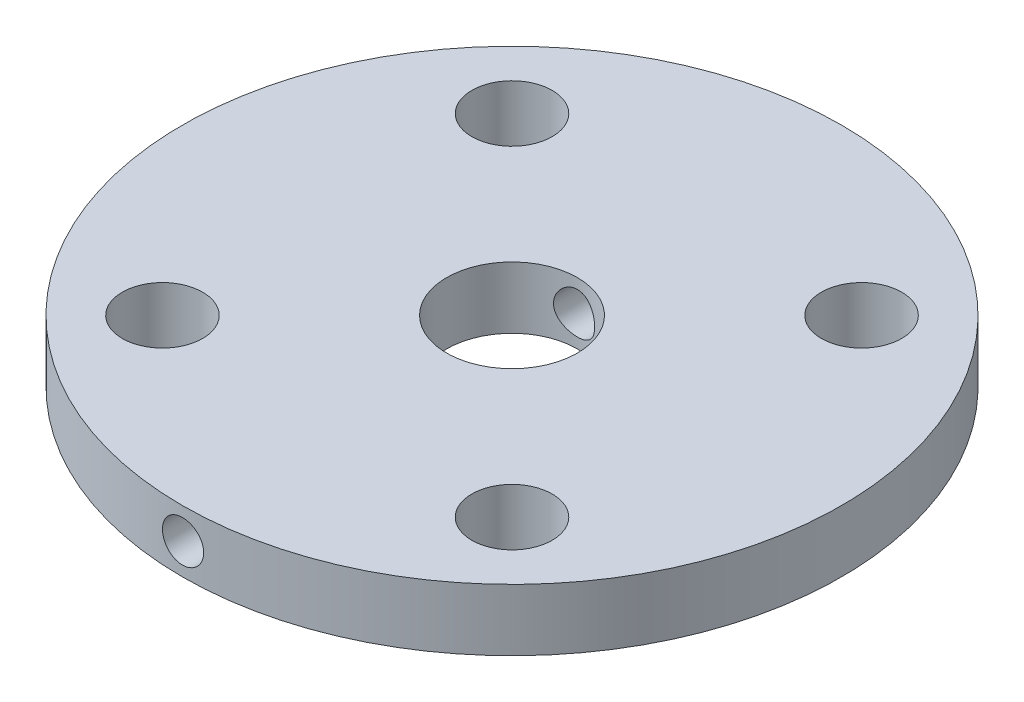
ISO-10303-21;
HEADER;
FILE_DESCRIPTION(('STEP AP214'),'2;1');
FILE_NAME('part.step','',(''),(''),'','','');
FILE_SCHEMA(('AUTOMOTIVE_DESIGN { 1 0 10303 214 1 1 1 1 }'));
ENDSEC;
DATA;
#1=APPLICATION_CONTEXT('core data for automotive mechanical design processes');
#2=APPLICATION_PROTOCOL_DEFINITION('international standard','automotive_design',2000,#1);
#3=PRODUCT_CONTEXT('',#1,'mechanical');
#4=PRODUCT('Part','Part','',(#3));
#5=PRODUCT_RELATED_PRODUCT_CATEGORY('part','',(#4));
#6=PRODUCT_DEFINITION_FORMATION('','',#4);
#7=PRODUCT_DEFINITION_CONTEXT('part definition',#1,'design');
#8=PRODUCT_DEFINITION('design','',#6,#7);
#9=PRODUCT_DEFINITION_SHAPE('','',#8);
#10=(LENGTH_UNIT() NAMED_UNIT(*) SI_UNIT(.MILLI.,.METRE.));
#11=(NAMED_UNIT(*) PLANE_ANGLE_UNIT() SI_UNIT($,.RADIAN.));
#12=(NAMED_UNIT(*) SI_UNIT($,.STERADIAN.) SOLID_ANGLE_UNIT());
#13=UNCERTAINTY_MEASURE_WITH_UNIT(LENGTH_MEASURE(1.E-05),#10,'distance_accuracy_value','');
#14=(GEOMETRIC_REPRESENTATION_CONTEXT(3) GLOBAL_UNCERTAINTY_ASSIGNED_CONTEXT((#13)) GLOBAL_UNIT_ASSIGNED_CONTEXT((#10,
#11,#12)) REPRESENTATION_CONTEXT('',''));
#15=CARTESIAN_POINT('',(0.,0.,0.));
#16=DIRECTION('',(0.,0.,1.));
#17=DIRECTION('',(1.,0.,0.));
#18=AXIS2_PLACEMENT_3D('',#15,#16,#17);
#19=CARTESIAN_POINT('',(0.,3.,0.));
#20=DIRECTION('',(0.,-1.,0.));
#21=DIRECTION('',(0.,0.,-1.));
#22=AXIS2_PLACEMENT_3D('',#19,#20,#21);
#23=CYLINDRICAL_SURFACE('',#22,16.);
#24=CARTESIAN_POINT('',(0.,2.5,-16.));
#25=CARTESIAN_POINT('',(-0.0561116734183644,2.49999753108858,-15.9999995845718));
#26=CARTESIAN_POINT('',(-0.112262635856497,2.49526135026496,-15.9997016695472));
#27=CARTESIAN_POINT('',(-0.223014105359193,2.47643576614751,-15.9985418686177));
#28=CARTESIAN_POINT('',(-0.277612730612397,2.46233547654854,-15.9976793263185));
#29=CARTESIAN_POINT('',(-0.383639254093895,2.42518824913568,-15.995487847518));
#30=CARTESIAN_POINT('',(-0.43506880833064,2.40214603069408,-15.9941591570758));
#31=CARTESIAN_POINT('',(-0.533316707904364,2.3477766795575,-15.9911848224785));
#32=CARTESIAN_POINT('',(-0.580136105926783,2.31645144425954,-15.989539250935));
#33=CARTESIAN_POINT('',(-0.667918229342462,2.24635384790991,-15.9861133677169));
#34=CARTESIAN_POINT('',(-0.708873140240784,2.20757170863627,-15.9843328810066));
#35=CARTESIAN_POINT('',(-0.783696905169765,2.1236813325073,-15.9808393328824));
#36=CARTESIAN_POINT('',(-0.817565463097674,2.07857283143688,-15.9791262742884));
#37=CARTESIAN_POINT('',(-0.877279186236974,1.98326595884957,-15.9759594183013));
#38=CARTESIAN_POINT('',(-0.903117860756827,1.93306351306165,-15.9745058310452));
#39=CARTESIAN_POINT('',(-0.945996818003629,1.82902237763191,-15.9720241042778));
#40=CARTESIAN_POINT('',(-0.96303719535256,1.77518372710297,-15.9709959601911));
#41=CARTESIAN_POINT('',(-0.98781415871503,1.66547373606911,-15.9694827304962));
#42=CARTESIAN_POINT('',(-0.995562984542585,1.60960516982239,-15.9689969305132));
#43=CARTESIAN_POINT('',(-1.00157466797485,1.49735836087158,-15.9686210332971));
#44=CARTESIAN_POINT('',(-0.999837633013961,1.44098012394711,-15.9687309293172));
#45=CARTESIAN_POINT('',(-0.986937060851419,1.32939774759017,-15.9695333678952));
#46=CARTESIAN_POINT('',(-0.975786769220214,1.2741920700683,-15.9702250917472));
#47=CARTESIAN_POINT('',(-0.944396744262123,1.16643750297721,-15.9721119435897));
#48=CARTESIAN_POINT('',(-0.924156956473655,1.11388862932888,-15.9733070745964));
#49=CARTESIAN_POINT('',(-0.875147436127337,1.01289678972627,-15.976066999066));
#50=CARTESIAN_POINT('',(-0.846371695029948,0.964456747007634,-15.9776320527627));
#51=CARTESIAN_POINT('',(-0.781111460834665,0.873089564719719,-15.9809551904227));
#52=CARTESIAN_POINT('',(-0.744626881072921,0.830162487136696,-15.982713276556));
#53=CARTESIAN_POINT('',(-0.664910031499466,0.750962711761426,-15.9862279896743));
#54=CARTESIAN_POINT('',(-0.621666298337665,0.714701550815685,-15.9879846089879));
#55=CARTESIAN_POINT('',(-0.529698860612806,0.649951919926683,-15.991295531007));
#56=CARTESIAN_POINT('',(-0.48097515413519,0.621463452699012,-15.9928498336419));
#57=CARTESIAN_POINT('',(-0.379423861379133,0.573068869909581,-15.9955810990219));
#58=CARTESIAN_POINT('',(-0.326596066323405,0.553163191296925,-15.996758042555));
#59=CARTESIAN_POINT('',(-0.218339310710279,0.522506942266674,-15.9986017059347));
#60=CARTESIAN_POINT('',(-0.162910380539017,0.511756264929576,-15.9992684317401));
#61=CARTESIAN_POINT('',(-0.0511248774990824,0.499729486382181,-16.0000157621239));
#62=CARTESIAN_POINT('',(0.00522997295839982,0.498437434453237,-16.0000973534494));
#63=CARTESIAN_POINT('',(0.117355606048469,0.505322906633079,-15.9996678453116));
#64=CARTESIAN_POINT('',(0.173126391718993,0.513500381462645,-15.9991567489326));
#65=CARTESIAN_POINT('',(0.282455831103055,0.539079571363428,-15.9976000372996));
#66=CARTESIAN_POINT('',(0.336016203553953,0.556473968261251,-15.9965548461366));
#67=CARTESIAN_POINT('',(0.439457481288669,0.599985805945472,-15.9940475327632));
#68=CARTESIAN_POINT('',(0.489338353473662,0.626103325188758,-15.9925854068029));
#69=CARTESIAN_POINT('',(0.584077738206346,0.686360630832902,-15.9894060556935));
#70=CARTESIAN_POINT('',(0.628929463573039,0.720511070281587,-15.9876884929127));
#71=CARTESIAN_POINT('',(0.712269053211648,0.79584930414363,-15.9841926926019));
#72=CARTESIAN_POINT('',(0.750756854818248,0.837037167846118,-15.9824144544745));
#73=CARTESIAN_POINT('',(0.820330100485797,0.925349893959178,-15.9789948666346));
#74=CARTESIAN_POINT('',(0.851405196389086,0.972482917214669,-15.9773537103402));
#75=CARTESIAN_POINT('',(0.905200136492261,1.07130700937391,-15.9743964406003));
#76=CARTESIAN_POINT('',(0.927920032215678,1.12299805016757,-15.9730803251503));
#77=CARTESIAN_POINT('',(0.964341719087062,1.22943306063595,-15.9709229534197));
#78=CARTESIAN_POINT('',(0.97805002342622,1.28417479428992,-15.9700813542419));
#79=CARTESIAN_POINT('',(0.996080670846894,1.39518833644789,-15.968966972331));
#80=CARTESIAN_POINT('',(1.00040310708364,1.45146012976037,-15.9686941839525));
#81=CARTESIAN_POINT('',(0.999538420240621,1.56383354163887,-15.9687483230443));
#82=CARTESIAN_POINT('',(0.994367566255264,1.61993528661128,-15.9690742245126));
#83=CARTESIAN_POINT('',(0.974696810271302,1.73047230619191,-15.9702868443231));
#84=CARTESIAN_POINT('',(0.960196891369881,1.78490757778055,-15.9711735636814));
#85=CARTESIAN_POINT('',(0.922283263126457,1.89056889695909,-15.973407642964));
#86=CARTESIAN_POINT('',(0.898869617796246,1.94179496759201,-15.9747549995802));
#87=CARTESIAN_POINT('',(0.843795411717915,2.03959109044531,-15.9777584946703));
#88=CARTESIAN_POINT('',(0.812135064586063,2.08616126322527,-15.9794146251456));
#89=CARTESIAN_POINT('',(0.741406059816915,2.17340611618713,-15.9828523464997));
#90=CARTESIAN_POINT('',(0.70232564585019,2.21407125752769,-15.9846341336137));
#91=CARTESIAN_POINT('',(0.617881549043877,2.28827789047344,-15.988120720492));
#92=CARTESIAN_POINT('',(0.572516331232764,2.32181763671957,-15.9898255013133));
#93=CARTESIAN_POINT('',(0.476738724866025,2.38084611029607,-15.9929677448517));
#94=CARTESIAN_POINT('',(0.426320161262644,2.4063248253584,-15.9944048742264));
#95=CARTESIAN_POINT('',(0.32194850775737,2.44842421732071,-15.9968453987164));
#96=CARTESIAN_POINT('',(0.267999641051182,2.46505526848698,-15.9978493015464));
#97=CARTESIAN_POINT('',(0.178100608228009,2.48466472436056,-15.9990471813266));
#98=CARTESIAN_POINT('',(0.14273153971185,2.49040801649776,-15.9994029003706));
#99=CARTESIAN_POINT('',(0.0715803108763633,2.49807643923667,-15.9998794420625));
#100=CARTESIAN_POINT('',(0.0357981511282327,2.50000157511724,-16.0000002650351));
#101=CARTESIAN_POINT('',(0.,2.5,-16.));
#102=B_SPLINE_CURVE_WITH_KNOTS('',3,(#24,#25,#26,#27,#28,#29,#30,#31,#32,#33,#34,#35,#36,#37,
#38,#39,#40,#41,#42,#43,#44,#45,#46,#47,#48,#49,#50,#51,#52,#53,#54,#55,#56,#57,#58,#59,#60,#61,
#62,#63,#64,#65,#66,#67,#68,#69,#70,#71,#72,#73,#74,#75,#76,#77,#78,#79,#80,#81,#82,#83,#84,#85,
#86,#87,#88,#89,#90,#91,#92,#93,#94,#95,#96,#97,#98,#99,#100,#101),.UNSPECIFIED.,.T.,.F.,(4,2,2,
2,2,2,2,2,2,2,2,2,2,2,2,2,2,2,2,2,2,2,2,2,2,2,2,2,2,2,2,2,2,2,2,2,2,2,4),(0.,0.168204335736812,
0.336604561629083,0.504916029841641,0.673188976167694,0.841684102124275,1.01018626723216,
1.17882428335738,1.34746048581395,1.5158742979282,1.68428620263516,1.85246152601026,
2.02063785705579,2.18893285109142,2.35722973722373,2.52581521111887,2.69440074391357,
2.86299485837158,3.03158700382427,3.19989477532544,3.36820167096043,3.53637513186954,
3.70455010539317,3.8729493782523,4.04135030923394,4.20998497032328,4.37861859148557,
4.54713019711468,4.71564013024963,4.88386154957344,5.05208327368919,5.2203037897837,
5.38851994885565,5.55700488735896,5.7255310486315,5.8942657148081,6.06280209381717,
6.17011332139855,6.27742440061437),.UNSPECIFIED.);
#103=CARTESIAN_POINT('',(0.,2.5,-16.));
#104=VERTEX_POINT('',#103);
#105=EDGE_CURVE('E86',#104,#104,#102,.T.);
#106=ORIENTED_EDGE('',*,*,#105,.T.);
#107=EDGE_LOOP('',(#106));
#108=FACE_BOUND('',#107,.T.);
#109=CARTESIAN_POINT('',(1.,1.5,15.9687194226713));
#110=CARTESIAN_POINT('',(0.999997530979189,1.4438884472806,15.9687198411353));
#111=CARTESIAN_POINT('',(0.995261369841746,1.38773760513601,15.969018353808));
#112=CARTESIAN_POINT('',(0.976435871032847,1.2769863855843,15.9701802900617));
#113=CARTESIAN_POINT('',(0.962335646645886,1.22238789008275,15.9710443711589));
#114=CARTESIAN_POINT('',(0.925188610022269,1.11636164088904,15.9732391891673));
#115=CARTESIAN_POINT('',(0.902146520267138,1.06493223008941,15.9745696797169));
#116=CARTESIAN_POINT('',(0.847777472120561,0.966684570565514,15.9775470893317));
#117=CARTESIAN_POINT('',(0.816452410807396,0.91986526933703,15.979193935917));
#118=CARTESIAN_POINT('',(0.74635498971825,0.832083035451518,15.9826212975974));
#119=CARTESIAN_POINT('',(0.707572812898322,0.791127948227644,15.9844019869887));
#120=CARTESIAN_POINT('',(0.623682287801146,0.716303843323424,15.9878947691017));
#121=CARTESIAN_POINT('',(0.578573675788047,0.682435121205567,15.9896068589598));
#122=CARTESIAN_POINT('',(0.483266707160287,0.622721227286503,15.9927710231964));
#123=CARTESIAN_POINT('',(0.43306429534244,0.596882515766822,15.9942228878238));
#124=CARTESIAN_POINT('',(0.329023233776073,0.55400348072674,15.9967011782085));
#125=CARTESIAN_POINT('',(0.275184622955805,0.536963063030846,15.9977276085194));
#126=CARTESIAN_POINT('',(0.165474748764174,0.512186014004023,15.9992381746231));
#127=CARTESIAN_POINT('',(0.109606260323203,0.504437139793369,15.9997230239649));
#128=CARTESIAN_POINT('',(-0.00264039663577823,0.498425332642003,16.0000981990362));
#129=CARTESIAN_POINT('',(-0.0590185594017607,0.500162292780172,15.9999885314668));
#130=CARTESIAN_POINT('',(-0.170601268404246,0.513062747473926,15.9991876257094));
#131=CARTESIAN_POINT('',(-0.225807343941721,0.524213071749852,15.9984972000676));
#132=CARTESIAN_POINT('',(-0.333562690243541,0.555603300349893,15.9966134446114));
#133=CARTESIAN_POINT('',(-0.386111945300423,0.575843258406096,15.9954201118241));
#134=CARTESIAN_POINT('',(-0.487104243384537,0.624853129246822,15.9926635052552));
#135=CARTESIAN_POINT('',(-0.535544382664921,0.653629010504596,15.991099972778));
#136=CARTESIAN_POINT('',(-0.626911698437901,0.718889542747454,15.9877789297274));
#137=CARTESIAN_POINT('',(-0.669838812883485,0.755374280480586,15.9860214169712));
#138=CARTESIAN_POINT('',(-0.749038406115801,0.835091240884198,15.9825066607318));
#139=CARTESIAN_POINT('',(-0.785299380057092,0.878334894966939,15.9807494228481));
#140=CARTESIAN_POINT('',(-0.850048671499497,0.970302108289596,15.9774363321876));
#141=CARTESIAN_POINT('',(-0.878536985907494,1.01902566971022,15.975880479491));
#142=CARTESIAN_POINT('',(-0.926931459210992,1.12057692578075,15.9731458545621));
#143=CARTESIAN_POINT('',(-0.946837133512335,1.17340485197314,15.9719671036228));
#144=CARTESIAN_POINT('',(-0.977493333620069,1.28166189223494,15.9701203713367));
#145=CARTESIAN_POINT('',(-0.988243967125888,1.33709097569638,15.9694523839814));
#146=CARTESIAN_POINT('',(-1.00027058075806,1.44887654587898,15.9687036349613));
#147=CARTESIAN_POINT('',(-1.00156255318282,1.50523130569735,15.9686218821213));
#148=CARTESIAN_POINT('',(-0.994676954357524,1.61735673831729,15.969052232218));
#149=CARTESIAN_POINT('',(-0.986499432380862,1.67312741415654,15.9695643320648));
#150=CARTESIAN_POINT('',(-0.960920259294965,1.78245632829255,15.9711237717849));
#151=CARTESIAN_POINT('',(-0.943525973475455,1.83601629642184,15.9721706842554));
#152=CARTESIAN_POINT('',(-0.900014493620536,1.93945681476954,15.9746814071507));
#153=CARTESIAN_POINT('',(-0.873897220477942,1.98933733161468,15.9761452213563));
#154=CARTESIAN_POINT('',(-0.813640273406212,2.08407648067029,15.9793271925999));
#155=CARTESIAN_POINT('',(-0.779489883827755,2.12892828586751,15.9810456882235));
#156=CARTESIAN_POINT('',(-0.70415170436153,2.21226805986129,15.9845421781084));
#157=CARTESIAN_POINT('',(-0.66296384556227,2.25075596633476,15.9863201729523));
#158=CARTESIAN_POINT('',(-0.574651072357626,2.32032942945236,15.9897382037197));
#159=CARTESIAN_POINT('',(-0.527517996495805,2.35140463726256,15.9913780447267));
#160=CARTESIAN_POINT('',(-0.428693770152175,2.40519977390251,15.994332187476));
#161=CARTESIAN_POINT('',(-0.377002647786563,2.4279197542668,15.9956464912261));
#162=CARTESIAN_POINT('',(-0.270567696249643,2.46434149916563,15.9978005355393));
#163=CARTESIAN_POINT('',(-0.215826115659464,2.47804981351641,15.9986406207087));
#164=CARTESIAN_POINT('',(-0.104812895574876,2.49608053285795,15.9997529424787));
#165=CARTESIAN_POINT('',(-0.0485412711395204,2.5004030301923,16.000025184666));
#166=CARTESIAN_POINT('',(0.063832252959847,2.49953851767714,15.9999711621222));
#167=CARTESIAN_POINT('',(0.119934278433168,2.49436770399843,15.999645916741));
#168=CARTESIAN_POINT('',(0.230471868848108,2.47469692976745,15.998435518434));
#169=CARTESIAN_POINT('',(0.284907430859812,2.46019695281398,15.9975503645239));
#170=CARTESIAN_POINT('',(0.390569318288325,2.42228310321836,15.9953196405464));
#171=CARTESIAN_POINT('',(0.441795666518811,2.39886929395129,15.9939740737523));
#172=CARTESIAN_POINT('',(0.539592275878477,2.34379467437962,15.9909736002392));
#173=CARTESIAN_POINT('',(0.58616265773806,2.31213407799313,15.9893187015444));
#174=CARTESIAN_POINT('',(0.673407488114299,2.24140480342907,15.985882362156));
#175=CARTESIAN_POINT('',(0.714072443678588,2.20232442561591,15.9841007244306));
#176=CARTESIAN_POINT('',(0.788278718736945,2.11788047694226,15.9806132737751));
#177=CARTESIAN_POINT('',(0.821818292391859,2.07251537070486,15.9789074795087));
#178=CARTESIAN_POINT('',(0.880846585182559,1.97673785081359,15.9757624815986));
#179=CARTESIAN_POINT('',(0.906325259723946,1.92631924220677,15.9743236114818));
#180=CARTESIAN_POINT('',(0.94842456336913,1.82194749238328,15.9718796544747));
#181=CARTESIAN_POINT('',(0.965055567355717,1.76799857462219,15.9708740597848));
#182=CARTESIAN_POINT('',(0.984664887060615,1.67809966855037,15.9696740541119));
#183=CARTESIAN_POINT('',(0.990408117992379,1.64273078746763,15.9693176670435));
#184=CARTESIAN_POINT('',(0.998076459396095,1.57157993435516,15.9688402180015));
#185=CARTESIAN_POINT('',(1.00000157518214,1.53579796290045,15.9687191557003));
#186=CARTESIAN_POINT('',(1.,1.5,15.9687194226713));
#187=B_SPLINE_CURVE_WITH_KNOTS('',3,(#109,#110,#111,#112,#113,#114,#115,#116,#117,#118,#119,
#120,#121,#122,#123,#124,#125,#126,#127,#128,#129,#130,#131,#132,#133,#134,#135,#136,#137,#138,
#139,#140,#141,#142,#143,#144,#145,#146,#147,#148,#149,#150,#151,#152,#153,#154,#155,#156,#157,
#158,#159,#160,#161,#162,#163,#164,#165,#166,#167,#168,#169,#170,#171,#172,#173,#174,#175,#176,
#177,#178,#179,#180,#181,#182,#183,#184,#185,#186),.UNSPECIFIED.,.T.,.F.,(4,2,2,2,2,2,2,2,2,2,2,
2,2,2,2,2,2,2,2,2,2,2,2,2,2,2,2,2,2,2,2,2,2,2,2,2,2,2,4),(0.,0.168203973235824,
0.336603844556243,0.50491489935846,0.673187438624218,0.841683038825124,1.01018566534422,
1.17882350626665,1.34745954207989,1.51587313181256,1.68428482324807,1.85246127888492,
2.02063872868625,2.18893404953364,2.35723126431538,2.52581626474337,2.69440133225935,
2.86299591720155,3.03158851877835,3.1998960052442,3.36820261594567,3.53637493205267,
3.70454877332519,3.87294823249217,4.04134934073537,4.20998419473402,4.37861800858551,
4.54712912090045,4.71563857528899,4.88386080932268,5.05208333910167,5.22030467288373,
5.38852164351148,5.55700609815315,5.72553178684829,5.89426665384357,6.06280322177696,
6.17011388566673,6.27742440020044),.UNSPECIFIED.);
#188=CARTESIAN_POINT('',(1.,1.5,15.9687194226713));
#189=VERTEX_POINT('',#188);
#190=EDGE_CURVE('E81',#189,#189,#187,.T.);
#191=ORIENTED_EDGE('',*,*,#190,.T.);
#192=EDGE_LOOP('',(#191));
#193=FACE_BOUND('',#192,.T.);
#194=CARTESIAN_POINT('',(0.,3.,0.));
#195=DIRECTION('',(0.,1.,0.));
#196=DIRECTION('',(0.,0.,1.));
#197=AXIS2_PLACEMENT_3D('',#194,#195,#196);
#198=CIRCLE('',#197,16.);
#199=CARTESIAN_POINT('',(0.,3.,16.));
#200=VERTEX_POINT('',#199);
#201=EDGE_CURVE('E11',#200,#200,#198,.T.);
#202=ORIENTED_EDGE('',*,*,#201,.F.);
#203=EDGE_LOOP('',(#202));
#204=FACE_BOUND('',#203,.T.);
#205=CARTESIAN_POINT('',(0.,0.,0.));
#206=DIRECTION('',(0.,1.,0.));
#207=DIRECTION('',(0.,0.,1.));
#208=AXIS2_PLACEMENT_3D('',#205,#206,#207);
#209=CIRCLE('',#208,16.);
#210=CARTESIAN_POINT('',(0.,0.,16.));
#211=VERTEX_POINT('',#210);
#212=EDGE_CURVE('E54',#211,#211,#209,.T.);
#213=ORIENTED_EDGE('',*,*,#212,.T.);
#214=EDGE_LOOP('',(#213));
#215=FACE_BOUND('',#214,.T.);
#216=ADVANCED_FACE('F41',(#108,#193,#204,#215),#23,.T.);
#217=CARTESIAN_POINT('',(0.,0.,0.));
#218=DIRECTION('',(0.,1.,0.));
#219=DIRECTION('',(0.,0.,1.));
#220=AXIS2_PLACEMENT_3D('',#217,#218,#219);
#221=PLANE('',#220);
#222=CARTESIAN_POINT('',(0.,0.,0.));
#223=DIRECTION('',(0.,-1.,0.));
#224=DIRECTION('',(0.,0.,-1.));
#225=AXIS2_PLACEMENT_3D('',#222,#223,#224);
#226=CIRCLE('',#225,3.175);
#227=CARTESIAN_POINT('',(0.,0.,-3.175));
#228=VERTEX_POINT('',#227);
#229=EDGE_CURVE('E92',#228,#228,#226,.T.);
#230=ORIENTED_EDGE('',*,*,#229,.F.);
#231=EDGE_LOOP('',(#230));
#232=FACE_BOUND('',#231,.T.);
#233=CARTESIAN_POINT('',(8.48528137423857,0.,8.48528137423857));
#234=DIRECTION('',(0.,1.,0.));
#235=DIRECTION('',(0.,0.,1.));
#236=AXIS2_PLACEMENT_3D('',#233,#234,#235);
#237=CIRCLE('',#236,1.95);
#238=CARTESIAN_POINT('',(8.48528137423857,0.,10.4352813742386));
#239=VERTEX_POINT('',#238);
#240=EDGE_CURVE('E101',#239,#239,#237,.T.);
#241=ORIENTED_EDGE('',*,*,#240,.T.);
#242=EDGE_LOOP('',(#241));
#243=FACE_BOUND('',#242,.T.);
#244=CARTESIAN_POINT('',(-8.48528137423857,0.,8.48528137423857));
#245=DIRECTION('',(0.,1.,0.));
#246=DIRECTION('',(0.,0.,1.));
#247=AXIS2_PLACEMENT_3D('',#244,#245,#246);
#248=CIRCLE('',#247,1.95);
#249=CARTESIAN_POINT('',(-8.48528137423857,0.,10.4352813742386));
#250=VERTEX_POINT('',#249);
#251=EDGE_CURVE('E107',#250,#250,#248,.T.);
#252=ORIENTED_EDGE('',*,*,#251,.T.);
#253=EDGE_LOOP('',(#252));
#254=FACE_BOUND('',#253,.T.);
#255=CARTESIAN_POINT('',(-8.48528137423857,0.,-8.48528137423857));
#256=DIRECTION('',(0.,1.,0.));
#257=DIRECTION('',(0.,0.,1.));
#258=AXIS2_PLACEMENT_3D('',#255,#256,#257);
#259=CIRCLE('',#258,1.95);
#260=CARTESIAN_POINT('',(-8.48528137423857,0.,-6.53528137423857));
#261=VERTEX_POINT('',#260);
#262=EDGE_CURVE('E113',#261,#261,#259,.T.);
#263=ORIENTED_EDGE('',*,*,#262,.T.);
#264=EDGE_LOOP('',(#263));
#265=FACE_BOUND('',#264,.T.);
#266=CARTESIAN_POINT('',(8.48528137423857,0.,-8.48528137423857));
#267=DIRECTION('',(0.,1.,0.));
#268=DIRECTION('',(0.,0.,1.));
#269=AXIS2_PLACEMENT_3D('',#266,#267,#268);
#270=CIRCLE('',#269,1.95);
#271=CARTESIAN_POINT('',(8.48528137423857,0.,-6.53528137423857));
#272=VERTEX_POINT('',#271);
#273=EDGE_CURVE('E59',#272,#272,#270,.T.);
#274=ORIENTED_EDGE('',*,*,#273,.T.);
#275=EDGE_LOOP('',(#274));
#276=FACE_BOUND('',#275,.T.);
#277=ORIENTED_EDGE('',*,*,#212,.F.);
#278=EDGE_LOOP('',(#277));
#279=FACE_BOUND('',#278,.T.);
#280=ADVANCED_FACE('F122',(#232,#243,#254,#265,#276,#279),#221,.F.);
#281=CARTESIAN_POINT('',(0.,3.,0.));
#282=DIRECTION('',(0.,1.,0.));
#283=DIRECTION('',(0.,0.,1.));
#284=AXIS2_PLACEMENT_3D('',#281,#282,#283);
#285=PLANE('',#284);
#286=CARTESIAN_POINT('',(0.,3.,0.));
#287=DIRECTION('',(0.,-1.,0.));
#288=DIRECTION('',(0.,0.,-1.));
#289=AXIS2_PLACEMENT_3D('',#286,#287,#288);
#290=CIRCLE('',#289,3.175);
#291=CARTESIAN_POINT('',(0.,3.,-3.175));
#292=VERTEX_POINT('',#291);
#293=EDGE_CURVE('E93',#292,#292,#290,.T.);
#294=ORIENTED_EDGE('',*,*,#293,.T.);
#295=EDGE_LOOP('',(#294));
#296=FACE_BOUND('',#295,.T.);
#297=CARTESIAN_POINT('',(8.48528137423857,3.,8.48528137423857));
#298=DIRECTION('',(0.,1.,0.));
#299=DIRECTION('',(0.,0.,1.));
#300=AXIS2_PLACEMENT_3D('',#297,#298,#299);
#301=CIRCLE('',#300,1.95);
#302=CARTESIAN_POINT('',(8.48528137423857,3.,10.4352813742386));
#303=VERTEX_POINT('',#302);
#304=EDGE_CURVE('E96',#303,#303,#301,.T.);
#305=ORIENTED_EDGE('',*,*,#304,.F.);
#306=EDGE_LOOP('',(#305));
#307=FACE_BOUND('',#306,.T.);
#308=CARTESIAN_POINT('',(-8.48528137423857,3.,8.48528137423857));
#309=DIRECTION('',(0.,1.,0.));
#310=DIRECTION('',(0.,0.,1.));
#311=AXIS2_PLACEMENT_3D('',#308,#309,#310);
#312=CIRCLE('',#311,1.95);
#313=CARTESIAN_POINT('',(-8.48528137423857,3.,10.4352813742386));
#314=VERTEX_POINT('',#313);
#315=EDGE_CURVE('E104',#314,#314,#312,.T.);
#316=ORIENTED_EDGE('',*,*,#315,.F.);
#317=EDGE_LOOP('',(#316));
#318=FACE_BOUND('',#317,.T.);
#319=CARTESIAN_POINT('',(-8.48528137423857,3.,-8.48528137423857));
#320=DIRECTION('',(0.,1.,0.));
#321=DIRECTION('',(0.,0.,1.));
#322=AXIS2_PLACEMENT_3D('',#319,#320,#321);
#323=CIRCLE('',#322,1.95);
#324=CARTESIAN_POINT('',(-8.48528137423857,3.,-6.53528137423857));
#325=VERTEX_POINT('',#324);
#326=EDGE_CURVE('E110',#325,#325,#323,.T.);
#327=ORIENTED_EDGE('',*,*,#326,.F.);
#328=EDGE_LOOP('',(#327));
#329=FACE_BOUND('',#328,.T.);
#330=CARTESIAN_POINT('',(8.48528137423857,3.,-8.48528137423857));
#331=DIRECTION('',(0.,1.,0.));
#332=DIRECTION('',(0.,0.,1.));
#333=AXIS2_PLACEMENT_3D('',#330,#331,#332);
#334=CIRCLE('',#333,1.95);
#335=CARTESIAN_POINT('',(8.48528137423857,3.,-6.53528137423857));
#336=VERTEX_POINT('',#335);
#337=EDGE_CURVE('E115',#336,#336,#334,.T.);
#338=ORIENTED_EDGE('',*,*,#337,.F.);
#339=EDGE_LOOP('',(#338));
#340=FACE_BOUND('',#339,.T.);
#341=ORIENTED_EDGE('',*,*,#201,.T.);
#342=EDGE_LOOP('',(#341));
#343=FACE_BOUND('',#342,.T.);
#344=ADVANCED_FACE('F128',(#296,#307,#318,#329,#340,#343),#285,.T.);
#345=CARTESIAN_POINT('',(8.48528137423857,3.,-8.48528137423857));
#346=DIRECTION('',(0.,1.,0.));
#347=DIRECTION('',(0.,0.,1.));
#348=AXIS2_PLACEMENT_3D('',#345,#346,#347);
#349=CYLINDRICAL_SURFACE('',#348,1.95);
#350=ORIENTED_EDGE('',*,*,#273,.F.);
#351=EDGE_LOOP('',(#350));
#352=FACE_BOUND('',#351,.T.);
#353=ORIENTED_EDGE('',*,*,#337,.T.);
#354=EDGE_LOOP('',(#353));
#355=FACE_BOUND('',#354,.T.);
#356=ADVANCED_FACE('F125',(#352,#355),#349,.F.);
#357=CARTESIAN_POINT('',(-8.48528137423857,3.,-8.48528137423857));
#358=DIRECTION('',(0.,1.,0.));
#359=DIRECTION('',(0.,0.,1.));
#360=AXIS2_PLACEMENT_3D('',#357,#358,#359);
#361=CYLINDRICAL_SURFACE('',#360,1.95);
#362=ORIENTED_EDGE('',*,*,#262,.F.);
#363=EDGE_LOOP('',(#362));
#364=FACE_BOUND('',#363,.T.);
#365=ORIENTED_EDGE('',*,*,#326,.T.);
#366=EDGE_LOOP('',(#365));
#367=FACE_BOUND('',#366,.T.);
#368=ADVANCED_FACE('F127',(#364,#367),#361,.F.);
#369=CARTESIAN_POINT('',(-8.48528137423857,3.,8.48528137423857));
#370=DIRECTION('',(0.,1.,0.));
#371=DIRECTION('',(0.,0.,1.));
#372=AXIS2_PLACEMENT_3D('',#369,#370,#371);
#373=CYLINDRICAL_SURFACE('',#372,1.95);
#374=ORIENTED_EDGE('',*,*,#251,.F.);
#375=EDGE_LOOP('',(#374));
#376=FACE_BOUND('',#375,.T.);
#377=ORIENTED_EDGE('',*,*,#315,.T.);
#378=EDGE_LOOP('',(#377));
#379=FACE_BOUND('',#378,.T.);
#380=ADVANCED_FACE('F134',(#376,#379),#373,.F.);
#381=CARTESIAN_POINT('',(8.48528137423857,3.,8.48528137423857));
#382=DIRECTION('',(0.,1.,0.));
#383=DIRECTION('',(0.,0.,1.));
#384=AXIS2_PLACEMENT_3D('',#381,#382,#383);
#385=CYLINDRICAL_SURFACE('',#384,1.95);
#386=ORIENTED_EDGE('',*,*,#240,.F.);
#387=EDGE_LOOP('',(#386));
#388=FACE_BOUND('',#387,.T.);
#389=ORIENTED_EDGE('',*,*,#304,.T.);
#390=EDGE_LOOP('',(#389));
#391=FACE_BOUND('',#390,.T.);
#392=ADVANCED_FACE('F157',(#388,#391),#385,.F.);
#393=CARTESIAN_POINT('',(0.,3.,0.));
#394=DIRECTION('',(0.,-1.,0.));
#395=DIRECTION('',(0.,0.,-1.));
#396=AXIS2_PLACEMENT_3D('',#393,#394,#395);
#397=CYLINDRICAL_SURFACE('',#396,3.175);
#398=CARTESIAN_POINT('',(0.,2.5,-3.175));
#399=CARTESIAN_POINT('',(0.0547296912714537,2.49999970822525,-3.17499977088693));
#400=CARTESIAN_POINT('',(0.109462524979991,2.49549220644921,-3.17357155660583));
#401=CARTESIAN_POINT('',(0.217326236894478,2.47762945875435,-3.16801413678203));
#402=CARTESIAN_POINT('',(0.270456772937091,2.46427233683271,-3.16388435854574));
#403=CARTESIAN_POINT('',(0.373544937828901,2.42920641963551,-3.15337468278599));
#404=CARTESIAN_POINT('',(0.423507382336771,2.4075106721404,-3.14699830190325));
#405=CARTESIAN_POINT('',(0.519085089165371,2.3564392798615,-3.13265291722843));
#406=CARTESIAN_POINT('',(0.564699644060966,2.32706238821468,-3.12468365491698));
#407=CARTESIAN_POINT('',(0.651715590093483,2.26049431939718,-3.10771841899058));
#408=CARTESIAN_POINT('',(0.69296172547261,2.22310598682194,-3.09869981513739));
#409=CARTESIAN_POINT('',(0.768714159168364,2.14199606378351,-3.08078265587317));
#410=CARTESIAN_POINT('',(0.803219177507195,2.09827327329687,-3.07188412355887));
#411=CARTESIAN_POINT('',(0.865356817043934,2.00438535311916,-3.05497110118082));
#412=CARTESIAN_POINT('',(0.892794583807973,1.95408576138588,-3.04698450245534));
#413=CARTESIAN_POINT('',(0.938756930463165,1.84929400669798,-3.03314041841616));
#414=CARTESIAN_POINT('',(0.957283900523935,1.79480297258036,-3.02728236226034));
#415=CARTESIAN_POINT('',(0.984328986225831,1.68492871622762,-3.01859552817898));
#416=CARTESIAN_POINT('',(0.993135447200717,1.62962354329246,-3.01567971343752));
#417=CARTESIAN_POINT('',(1.00139043611312,1.51824971919899,-3.01294919368907));
#418=CARTESIAN_POINT('',(1.00084149711907,1.46218127881115,-3.01313364925261));
#419=CARTESIAN_POINT('',(0.990626603048232,1.35326601872851,-3.01650606577504));
#420=CARTESIAN_POINT('',(0.981328292691464,1.30038033436941,-3.01957290418673));
#421=CARTESIAN_POINT('',(0.954475106868846,1.19696153285723,-3.02816759989572));
#422=CARTESIAN_POINT('',(0.936919341248802,1.14642866998405,-3.03369572251617));
#423=CARTESIAN_POINT('',(0.893792170397776,1.04827883459382,-3.04668217576845));
#424=CARTESIAN_POINT('',(0.868106079346418,1.00071602699363,-3.05416783897725));
#425=CARTESIAN_POINT('',(0.8095270332392,0.910455639249295,-3.07021352886759));
#426=CARTESIAN_POINT('',(0.776632181307808,0.867759344157254,-3.07877383807212));
#427=CARTESIAN_POINT('',(0.702769740272769,0.786366938386971,-3.09648912197233));
#428=CARTESIAN_POINT('',(0.661498979023841,0.74794743853815,-3.10565328214935));
#429=CARTESIAN_POINT('',(0.572986438636278,0.678506961996073,-3.12319458509764));
#430=CARTESIAN_POINT('',(0.525744203469922,0.647486550877088,-3.13157166767633));
#431=CARTESIAN_POINT('',(0.426090527137988,0.59353339531022,-3.14668531586627));
#432=CARTESIAN_POINT('',(0.373640641850758,0.570667559270443,-3.15340817536147));
#433=CARTESIAN_POINT('',(0.26537769928554,0.534166073051939,-3.16435690127797));
#434=CARTESIAN_POINT('',(0.209565685835569,0.520527574014948,-3.16858353833448));
#435=CARTESIAN_POINT('',(0.0985100089176777,0.503341266089366,-3.17393916454297));
#436=CARTESIAN_POINT('',(0.0433297380602024,0.499419075419201,-3.17518302049876));
#437=CARTESIAN_POINT('',(-0.0669069631810185,0.500719900723257,-3.17477320886751));
#438=CARTESIAN_POINT('',(-0.121963410755249,0.505941557271962,-3.17311997199434));
#439=CARTESIAN_POINT('',(-0.228939318894398,0.525081769269416,-3.16717725984726));
#440=CARTESIAN_POINT('',(-0.280902912054907,0.538776748364465,-3.16295560108281));
#441=CARTESIAN_POINT('',(-0.38177956322811,0.574201275816663,-3.1523711472246));
#442=CARTESIAN_POINT('',(-0.430692241866625,0.59593182105946,-3.1460080864791));
#443=CARTESIAN_POINT('',(-0.525418206030201,0.647408123852152,-3.13159928152845));
#444=CARTESIAN_POINT('',(-0.571125550767367,0.677338025901108,-3.1235159701746));
#445=CARTESIAN_POINT('',(-0.656994164905949,0.744143059152401,-3.10659012570712));
#446=CARTESIAN_POINT('',(-0.69715390234999,0.781020102170754,-3.09774738396767));
#447=CARTESIAN_POINT('',(-0.772467481331416,0.862433651585681,-3.07985049022315));
#448=CARTESIAN_POINT('',(-0.807354426574353,0.907218906130438,-3.07080217588022));
#449=CARTESIAN_POINT('',(-0.869142750168093,1.00220454158585,-3.0538902422491));
#450=CARTESIAN_POINT('',(-0.896044236324067,1.05240484937981,-3.04602660696822));
#451=CARTESIAN_POINT('',(-0.940934862747076,1.15670461217978,-3.03246068603307));
#452=CARTESIAN_POINT('',(-0.958956890783238,1.21078881561542,-3.02675044336555));
#453=CARTESIAN_POINT('',(-0.985571717214639,1.32144148158481,-3.01819029335228));
#454=CARTESIAN_POINT('',(-0.994168177254621,1.37800897052325,-3.0153392752917));
#455=CARTESIAN_POINT('',(-1.00142219684781,1.48922877489482,-3.01293735941695));
#456=CARTESIAN_POINT('',(-1.0005181717301,1.54384970122215,-3.01324088275183));
#457=CARTESIAN_POINT('',(-0.989857610931103,1.65212030627078,-3.0167594706264));
#458=CARTESIAN_POINT('',(-0.980101500533681,1.70577003152553,-3.0199743952926));
#459=CARTESIAN_POINT('',(-0.952309206717144,1.8097777198713,-3.02885102836801));
#460=CARTESIAN_POINT('',(-0.934400369949955,1.86017317403129,-3.03447502969983));
#461=CARTESIAN_POINT('',(-0.890911559936396,1.95728407818689,-3.04752598638222));
#462=CARTESIAN_POINT('',(-0.865330008688246,2.00399876868371,-3.05495331255203));
#463=CARTESIAN_POINT('',(-0.806035833848745,2.0944276677601,-3.07114148239642));
#464=CARTESIAN_POINT('',(-0.772041003052765,2.13794943577867,-3.07994352673079));
#465=CARTESIAN_POINT('',(-0.697379573947813,2.21881258037476,-3.09770191200223));
#466=CARTESIAN_POINT('',(-0.656711179829986,2.25615228795521,-3.10665829388825));
#467=CARTESIAN_POINT('',(-0.568225114538841,2.32483929459132,-3.12407465248793));
#468=CARTESIAN_POINT('',(-0.52021421006017,2.35594514558978,-3.13250810342269));
#469=CARTESIAN_POINT('',(-0.419379546162353,2.40960394046909,-3.14759249919245));
#470=CARTESIAN_POINT('',(-0.36655761422802,2.43216011530641,-3.15424411710996));
#471=CARTESIAN_POINT('',(-0.261962042294977,2.46651940551333,-3.16457555277795));
#472=CARTESIAN_POINT('',(-0.210442190481205,2.47903801138309,-3.16845043878596));
#473=CARTESIAN_POINT('',(-0.105949002100726,2.49577757843971,-3.17366250677999));
#474=CARTESIAN_POINT('',(-0.0529759731882375,2.50000028242533,-3.17500022177154));
#475=CARTESIAN_POINT('',(0.,2.5,-3.175));
#476=B_SPLINE_CURVE_WITH_KNOTS('',3,(#398,#399,#400,#401,#402,#403,#404,#405,#406,#407,#408,
#409,#410,#411,#412,#413,#414,#415,#416,#417,#418,#419,#420,#421,#422,#423,#424,#425,#426,#427,
#428,#429,#430,#431,#432,#433,#434,#435,#436,#437,#438,#439,#440,#441,#442,#443,#444,#445,#446,
#447,#448,#449,#450,#451,#452,#453,#454,#455,#456,#457,#458,#459,#460,#461,#462,#463,#464,#465,
#466,#467,#468,#469,#470,#471,#472,#473,#474,#475),.UNSPECIFIED.,.T.,.F.,(4,2,2,2,2,2,2,2,2,2,2,
2,2,2,2,2,2,2,2,2,2,2,2,2,2,2,2,2,2,2,2,2,2,2,2,2,2,2,4),(0.,0.163994325279003,
0.328023426321471,0.491796902586538,0.655596980357709,0.8240203236982,0.992475615611057,
1.16517124559537,1.33782052704507,1.50519797716032,1.67253010887143,1.83313085740763,
1.99374892268386,2.15674198772438,2.31977799351393,2.49035999718005,2.66095503568065,
2.83291924141971,3.00483033048147,3.17000661712972,3.33515834892811,3.49612801026556,
3.65711764806859,3.82207042935418,3.98706867125012,4.15871505435916,4.33035912010495,
4.50136257919592,4.67229958329847,4.83538439668807,4.99846137535133,5.15907412183619,
5.31971992327092,5.48673605516536,5.65379720384563,5.82643124338402,5.99899997863712,
6.15777274851477,6.31651215992335),.UNSPECIFIED.);
#477=CARTESIAN_POINT('',(0.,2.5,-3.175));
#478=VERTEX_POINT('',#477);
#479=EDGE_CURVE('E45',#478,#478,#476,.T.);
#480=ORIENTED_EDGE('',*,*,#479,.T.);
#481=EDGE_LOOP('',(#480));
#482=FACE_BOUND('',#481,.T.);
#483=CARTESIAN_POINT('',(1.,1.5,3.01340753964677));
#484=CARTESIAN_POINT('',(0.999999697099396,1.55465364566927,3.01340782507697));
#485=CARTESIAN_POINT('',(0.995504262982259,1.60931044232899,3.01491067232392));
#486=CARTESIAN_POINT('',(0.977693794452442,1.71701673548991,3.02073257821208));
#487=CARTESIAN_POINT('',(0.964376487442752,1.77006581414446,3.02505236251815));
#488=CARTESIAN_POINT('',(0.929426847736096,1.87298078886054,3.03597139090515));
#489=CARTESIAN_POINT('',(0.907809408335313,1.92285220093517,3.04256655004205));
#490=CARTESIAN_POINT('',(0.856922980177694,2.01827456921943,3.05728751350333));
#491=CARTESIAN_POINT('',(0.827652599363703,2.06382473734562,3.0654135962249));
#492=CARTESIAN_POINT('',(0.761197188783761,2.15090125973968,3.08259887239432));
#493=CARTESIAN_POINT('',(0.723790985998276,2.19225463716358,3.09167945838375));
#494=CARTESIAN_POINT('',(0.64259888126681,2.26821745458897,3.10956870066096));
#495=CARTESIAN_POINT('',(0.598812075311808,2.30282593734154,3.11837731820136));
#496=CARTESIAN_POINT('',(0.504856162784577,2.36508233427085,3.13497517696012));
#497=CARTESIAN_POINT('',(0.454563377824161,2.39255175212668,3.14273629688082));
#498=CARTESIAN_POINT('',(0.349785494065427,2.43857437495836,3.15611462176925));
#499=CARTESIAN_POINT('',(0.295301400731918,2.45712971066824,3.16173233900864));
#500=CARTESIAN_POINT('',(0.185498945532638,2.48421885858348,3.17003946190217));
#501=CARTESIAN_POINT('',(0.130260183737484,2.49304839538065,3.17281508679625));
#502=CARTESIAN_POINT('',(0.0190201690076673,2.50137266773815,3.17542997602103));
#503=CARTESIAN_POINT('',(-0.0369809049571174,2.50086955782638,3.17526991808138));
#504=CARTESIAN_POINT('',(-0.146073176767453,2.49073655708308,3.17209132563814));
#505=CARTESIAN_POINT('',(-0.199197553047994,2.48142731555179,3.16917322045475));
#506=CARTESIAN_POINT('',(-0.303087547670424,2.45447290855482,3.16093022878886));
#507=CARTESIAN_POINT('',(-0.35385301113767,2.43682719660435,3.15560518452407));
#508=CARTESIAN_POINT('',(-0.452319483418945,2.39349691761638,3.1430126272538));
#509=CARTESIAN_POINT('',(-0.499974895772522,2.36771574875892,3.13572193377395));
#510=CARTESIAN_POINT('',(-0.590382274234304,2.30892411795336,3.11996517826373));
#511=CARTESIAN_POINT('',(-0.633132981198568,2.27591180591431,3.11149881564123));
#512=CARTESIAN_POINT('',(-0.714428940605535,2.20195219443641,3.09386821519513));
#513=CARTESIAN_POINT('',(-0.752719803251581,2.16072830991096,3.08468960604182));
#514=CARTESIAN_POINT('',(-0.821921392158447,2.07235932111506,3.06697724991279));
#515=CARTESIAN_POINT('',(-0.852831220269334,2.02521349730652,3.05844358150197));
#516=CARTESIAN_POINT('',(-0.906695615243572,1.92561020037067,3.04291409504693));
#517=CARTESIAN_POINT('',(-0.929554471043208,1.87309781114129,3.03593711842118));
#518=CARTESIAN_POINT('',(-0.96602430158494,1.76469613581739,3.02453160318434));
#519=CARTESIAN_POINT('',(-0.979638661470225,1.70880809398931,3.02010213182052));
#520=CARTESIAN_POINT('',(-0.99673915300437,1.59768197966338,3.01450065783554));
#521=CARTESIAN_POINT('',(-1.00061540233401,1.54251022644793,3.01320326881709));
#522=CARTESIAN_POINT('',(-0.999225964152388,1.43230030724485,3.01366445278795));
#523=CARTESIAN_POINT('',(-0.993961716707265,1.37726212158193,3.01542254439272));
#524=CARTESIAN_POINT('',(-0.974789591492594,1.27057198242031,3.02167266538105));
#525=CARTESIAN_POINT('',(-0.9611414822915,1.21886802897313,3.02608245015605));
#526=CARTESIAN_POINT('',(-0.925894811300574,1.11849026764043,3.03705156036141));
#527=CARTESIAN_POINT('',(-0.904294939334157,1.06981696064704,3.04361124000083));
#528=CARTESIAN_POINT('',(-0.853042394417418,0.975317665365927,3.05837744570789));
#529=CARTESIAN_POINT('',(-0.823174086429549,0.929615408240646,3.06662626378015));
#530=CARTESIAN_POINT('',(-0.756483400389965,0.84372969933746,3.08375439300821));
#531=CARTESIAN_POINT('',(-0.719659187490986,0.803547708551836,3.09263387013443));
#532=CARTESIAN_POINT('',(-0.638253881661344,0.728093593385521,3.11047621930544));
#533=CARTESIAN_POINT('',(-0.593411031585854,0.693100213847725,3.11942679842716));
#534=CARTESIAN_POINT('',(-0.498272691254154,0.631123354353255,3.13602895234888));
#535=CARTESIAN_POINT('',(-0.447977445704734,0.604139515126609,3.14368058540684));
#536=CARTESIAN_POINT('',(-0.343666085752119,0.559205724412408,3.15677977172257));
#537=CARTESIAN_POINT('',(-0.289679980240055,0.541190941152336,3.16224308507325));
#538=CARTESIAN_POINT('',(-0.179241457755453,0.514557869701703,3.17041928462052));
#539=CARTESIAN_POINT('',(-0.122789831977917,0.505936589810602,3.17313304649181));
#540=CARTESIAN_POINT('',(-0.0115866686867306,0.498581351656221,3.17544541940408));
#541=CARTESIAN_POINT('',(0.0431359336174869,0.499445060707066,3.1751707959358));
#542=CARTESIAN_POINT('',(0.151620955885123,0.510060087742547,3.17184186783807));
#543=CARTESIAN_POINT('',(0.205383439899084,0.519810810589532,3.16878774934339));
#544=CARTESIAN_POINT('',(0.309740695408024,0.547665559109349,3.16028386536029));
#545=CARTESIAN_POINT('',(0.360367342656291,0.565660403140746,3.15486545484899));
#546=CARTESIAN_POINT('',(0.457906775115321,0.60939371583913,3.14219159345216));
#547=CARTESIAN_POINT('',(0.504818916800714,0.635133522602763,3.13493582516079));
#548=CARTESIAN_POINT('',(0.595348340331148,0.694646328094461,3.11903367638954));
#549=CARTESIAN_POINT('',(0.638797490701293,0.728664511575291,3.11034814438078));
#550=CARTESIAN_POINT('',(0.719503926915736,0.803337784174197,3.09267670329972));
#551=CARTESIAN_POINT('',(0.756759339155353,0.843994874214754,3.08369070432));
#552=CARTESIAN_POINT('',(0.825292982467253,0.932439084735572,3.06607449463046));
#553=CARTESIAN_POINT('',(0.856326528839864,0.980420800381732,3.0574665861762));
#554=CARTESIAN_POINT('',(0.90985699882477,1.08117856625764,3.04196746533699));
#555=CARTESIAN_POINT('',(0.932357240272183,1.13395274321749,3.03507558610126));
#556=CARTESIAN_POINT('',(0.966618593968749,1.23842315142153,3.02432973720816));
#557=CARTESIAN_POINT('',(0.979099377984614,1.28986314537377,3.02027561165945));
#558=CARTESIAN_POINT('',(0.995789166807718,1.39420136054041,3.01481471423949));
#559=CARTESIAN_POINT('',(1.00000029318599,1.44709920421287,3.01340726337088));
#560=CARTESIAN_POINT('',(1.,1.5,3.01340753964677));
#561=B_SPLINE_CURVE_WITH_KNOTS('',3,(#483,#484,#485,#486,#487,#488,#489,#490,#491,#492,#493,
#494,#495,#496,#497,#498,#499,#500,#501,#502,#503,#504,#505,#506,#507,#508,#509,#510,#511,#512,
#513,#514,#515,#516,#517,#518,#519,#520,#521,#522,#523,#524,#525,#526,#527,#528,#529,#530,#531,
#532,#533,#534,#535,#536,#537,#538,#539,#540,#541,#542,#543,#544,#545,#546,#547,#548,#549,#550,
#551,#552,#553,#554,#555,#556,#557,#558,#559,#560),.UNSPECIFIED.,.T.,.F.,(4,2,2,2,2,2,2,2,2,2,2,
2,2,2,2,2,2,2,2,2,2,2,2,2,2,2,2,2,2,2,2,2,2,2,2,2,2,2,4),(0.,0.163765468726709,0.32757314138512,
0.491088249998353,0.654633122452139,0.823354060058445,0.992098925467682,1.16472680410822,
1.33731339893184,1.50449356485544,1.67163513617055,1.83291588598218,1.99420720977823,
2.15749076416086,2.3208161436054,2.49105030473655,2.66130517000829,2.83352067199454,
3.00567307816946,3.1708102761668,3.33592145950495,3.49615817024587,3.6564212943019,
3.82133839666895,3.98629906221479,4.15822088470949,4.3301349944413,4.50078771620436,
4.67138607154115,4.83477696542924,4.99815691830488,5.15943304036168,5.32073704209692,
5.48757194112553,5.6544572162139,5.82698505810699,5.99944575049403,6.1579996207539,
6.3165128088863),.UNSPECIFIED.);
#562=CARTESIAN_POINT('',(1.,1.5,3.01340753964677));
#563=VERTEX_POINT('',#562);
#564=EDGE_CURVE('E63',#563,#563,#561,.T.);
#565=ORIENTED_EDGE('',*,*,#564,.T.);
#566=EDGE_LOOP('',(#565));
#567=FACE_BOUND('',#566,.T.);
#568=ORIENTED_EDGE('',*,*,#293,.F.);
#569=EDGE_LOOP('',(#568));
#570=FACE_BOUND('',#569,.T.);
#571=ORIENTED_EDGE('',*,*,#229,.T.);
#572=EDGE_LOOP('',(#571));
#573=FACE_BOUND('',#572,.T.);
#574=ADVANCED_FACE('F68',(#482,#567,#570,#573),#397,.F.);
#575=CARTESIAN_POINT('',(0.,1.5,-24.));
#576=DIRECTION('',(0.,0.,1.));
#577=DIRECTION('',(1.,0.,0.));
#578=AXIS2_PLACEMENT_3D('',#575,#576,#577);
#579=CYLINDRICAL_SURFACE('',#578,1.);
#580=ORIENTED_EDGE('',*,*,#564,.F.);
#581=EDGE_LOOP('',(#580));
#582=FACE_BOUND('',#581,.T.);
#583=ORIENTED_EDGE('',*,*,#190,.F.);
#584=EDGE_LOOP('',(#583));
#585=FACE_BOUND('',#584,.T.);
#586=ADVANCED_FACE('F74',(#582,#585),#579,.F.);
#587=ORIENTED_EDGE('',*,*,#479,.F.);
#588=EDGE_LOOP('',(#587));
#589=FACE_BOUND('',#588,.T.);
#590=ORIENTED_EDGE('',*,*,#105,.F.);
#591=EDGE_LOOP('',(#590));
#592=FACE_BOUND('',#591,.T.);
#593=ADVANCED_FACE('F71',(#589,#592),#579,.F.);
#594=CLOSED_SHELL('',(#216,#280,#344,#356,#368,#380,#392,#574,#586,#593));
#595=MANIFOLD_SOLID_BREP('B2',#594);
#596=ADVANCED_BREP_SHAPE_REPRESENTATION('',(#18,#595),#14);
#597=SHAPE_DEFINITION_REPRESENTATION(#9,#596);
ENDSEC;
END-ISO-10303-21;
